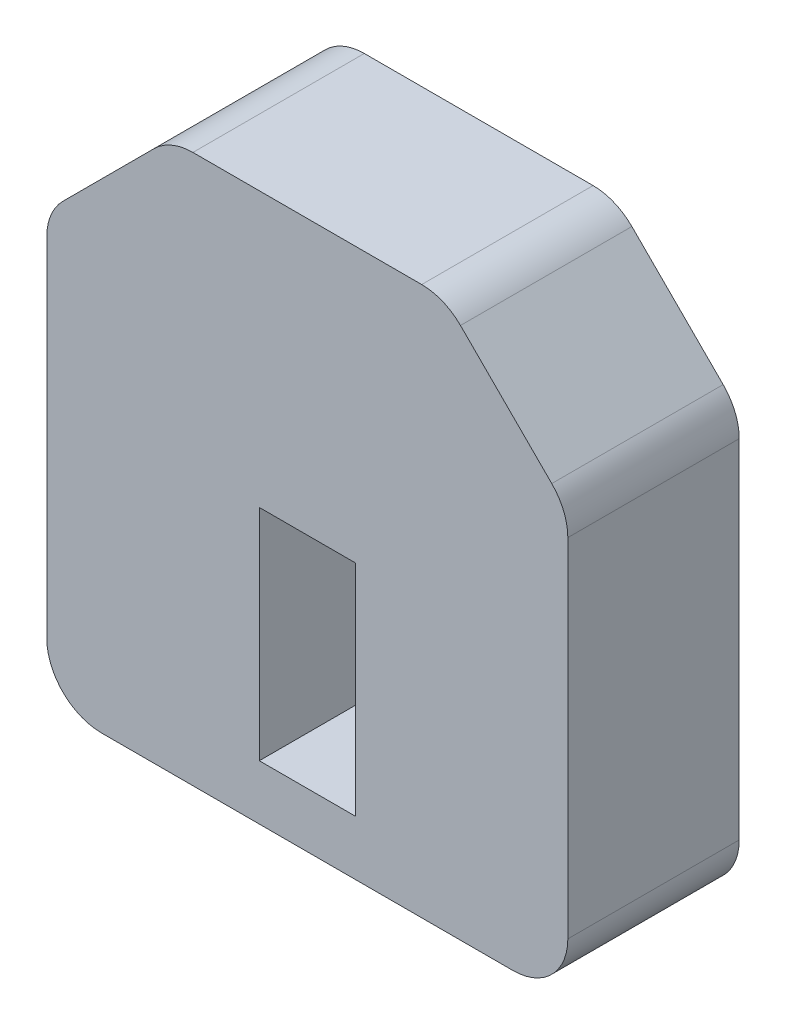
ISO-10303-21;
HEADER;
FILE_DESCRIPTION(('STEP AP214'),'2;1');
FILE_NAME('part.step','',(''),(''),'','','');
FILE_SCHEMA(('AUTOMOTIVE_DESIGN { 1 0 10303 214 1 1 1 1 }'));
ENDSEC;
DATA;
#1=APPLICATION_CONTEXT('core data for automotive mechanical design processes');
#2=APPLICATION_PROTOCOL_DEFINITION('international standard','automotive_design',2000,#1);
#3=PRODUCT_CONTEXT('',#1,'mechanical');
#4=PRODUCT('Part','Part','',(#3));
#5=PRODUCT_RELATED_PRODUCT_CATEGORY('part','',(#4));
#6=PRODUCT_DEFINITION_FORMATION('','',#4);
#7=PRODUCT_DEFINITION_CONTEXT('part definition',#1,'design');
#8=PRODUCT_DEFINITION('design','',#6,#7);
#9=PRODUCT_DEFINITION_SHAPE('','',#8);
#10=(LENGTH_UNIT() NAMED_UNIT(*) SI_UNIT(.MILLI.,.METRE.));
#11=(NAMED_UNIT(*) PLANE_ANGLE_UNIT() SI_UNIT($,.RADIAN.));
#12=(NAMED_UNIT(*) SI_UNIT($,.STERADIAN.) SOLID_ANGLE_UNIT());
#13=UNCERTAINTY_MEASURE_WITH_UNIT(LENGTH_MEASURE(1.E-05),#10,'distance_accuracy_value','');
#14=(GEOMETRIC_REPRESENTATION_CONTEXT(3) GLOBAL_UNCERTAINTY_ASSIGNED_CONTEXT((#13)) GLOBAL_UNIT_ASSIGNED_CONTEXT((#10,
#11,#12)) REPRESENTATION_CONTEXT('',''));
#15=CARTESIAN_POINT('',(0.,0.,0.));
#16=DIRECTION('',(0.,0.,1.));
#17=DIRECTION('',(1.,0.,0.));
#18=AXIS2_PLACEMENT_3D('',#15,#16,#17);
#19=CARTESIAN_POINT('',(0.,0.,12.5));
#20=DIRECTION('',(0.,0.,1.));
#21=DIRECTION('',(1.,0.,0.));
#22=AXIS2_PLACEMENT_3D('',#19,#20,#21);
#23=PLANE('',#22);
#24=DIRECTION('',(0.,-1.,0.));
#25=VECTOR('',#24,1.);
#26=CARTESIAN_POINT('',(-19.,-20.,12.5));
#27=LINE('',#26,#25);
#28=CARTESIAN_POINT('',(-19.,9.3431457505076,12.5));
#29=VERTEX_POINT('',#28);
#30=CARTESIAN_POINT('',(-19.,-16.,12.5));
#31=VERTEX_POINT('',#30);
#32=EDGE_CURVE('E188',#29,#31,#27,.T.);
#33=ORIENTED_EDGE('',*,*,#32,.T.);
#34=CARTESIAN_POINT('',(-15.,-16.,12.5));
#35=DIRECTION('',(0.,0.,1.));
#36=DIRECTION('',(1.,0.,0.));
#37=AXIS2_PLACEMENT_3D('',#34,#35,#36);
#38=CIRCLE('',#37,4.);
#39=CARTESIAN_POINT('',(-15.,-20.,12.5));
#40=VERTEX_POINT('',#39);
#41=EDGE_CURVE('E252',#31,#40,#38,.T.);
#42=ORIENTED_EDGE('',*,*,#41,.T.);
#43=DIRECTION('',(1.,0.,0.));
#44=VECTOR('',#43,1.);
#45=CARTESIAN_POINT('',(19.,-20.,12.5));
#46=LINE('',#45,#44);
#47=CARTESIAN_POINT('',(15.,-20.,12.5));
#48=VERTEX_POINT('',#47);
#49=EDGE_CURVE('E191',#40,#48,#46,.T.);
#50=ORIENTED_EDGE('',*,*,#49,.T.);
#51=CARTESIAN_POINT('',(15.,-16.,12.5));
#52=DIRECTION('',(0.,0.,1.));
#53=DIRECTION('',(1.,0.,0.));
#54=AXIS2_PLACEMENT_3D('',#51,#52,#53);
#55=CIRCLE('',#54,4.);
#56=CARTESIAN_POINT('',(19.,-16.,12.5));
#57=VERTEX_POINT('',#56);
#58=EDGE_CURVE('E250',#48,#57,#55,.T.);
#59=ORIENTED_EDGE('',*,*,#58,.T.);
#60=DIRECTION('',(0.,1.,0.));
#61=VECTOR('',#60,1.);
#62=CARTESIAN_POINT('',(19.,-20.,12.5));
#63=LINE('',#62,#61);
#64=CARTESIAN_POINT('',(19.,9.34314575050759,12.5));
#65=VERTEX_POINT('',#64);
#66=EDGE_CURVE('E195',#57,#65,#63,.T.);
#67=ORIENTED_EDGE('',*,*,#66,.T.);
#68=CARTESIAN_POINT('',(15.,9.34314575050759,12.5));
#69=DIRECTION('',(0.,0.,1.));
#70=DIRECTION('',(1.,0.,0.));
#71=AXIS2_PLACEMENT_3D('',#68,#69,#70);
#72=CIRCLE('',#71,4.);
#73=CARTESIAN_POINT('',(17.8284271247462,12.1715728752538,12.5));
#74=VERTEX_POINT('',#73);
#75=EDGE_CURVE('E248',#65,#74,#72,.T.);
#76=ORIENTED_EDGE('',*,*,#75,.T.);
#77=DIRECTION('',(0.707106781186546,-0.707106781186549,0.));
#78=VECTOR('',#77,1.);
#79=CARTESIAN_POINT('',(15.,15.,12.5));
#80=LINE('',#79,#78);
#81=CARTESIAN_POINT('',(11.1715728752538,18.8284271247462,12.5));
#82=VERTEX_POINT('',#81);
#83=EDGE_CURVE('E218',#74,#82,#80,.F.);
#84=ORIENTED_EDGE('',*,*,#83,.T.);
#85=CARTESIAN_POINT('',(8.34314575050762,16.,12.5));
#86=DIRECTION('',(0.,0.,1.));
#87=DIRECTION('',(1.,0.,0.));
#88=AXIS2_PLACEMENT_3D('',#85,#86,#87);
#89=CIRCLE('',#88,4.);
#90=CARTESIAN_POINT('',(8.34314575050762,20.,12.5));
#91=VERTEX_POINT('',#90);
#92=EDGE_CURVE('E246',#82,#91,#89,.T.);
#93=ORIENTED_EDGE('',*,*,#92,.T.);
#94=DIRECTION('',(-1.,0.,0.));
#95=VECTOR('',#94,1.);
#96=CARTESIAN_POINT('',(19.,20.,12.5));
#97=LINE('',#96,#95);
#98=CARTESIAN_POINT('',(-8.34314575050759,20.,12.5));
#99=VERTEX_POINT('',#98);
#100=EDGE_CURVE('E198',#91,#99,#97,.T.);
#101=ORIENTED_EDGE('',*,*,#100,.T.);
#102=CARTESIAN_POINT('',(-8.34314575050759,16.,12.5));
#103=DIRECTION('',(0.,0.,1.));
#104=DIRECTION('',(1.,0.,0.));
#105=AXIS2_PLACEMENT_3D('',#102,#103,#104);
#106=CIRCLE('',#105,4.);
#107=CARTESIAN_POINT('',(-11.1715728752538,18.8284271247462,12.5));
#108=VERTEX_POINT('',#107);
#109=EDGE_CURVE('E54',#99,#108,#106,.T.);
#110=ORIENTED_EDGE('',*,*,#109,.T.);
#111=DIRECTION('',(0.707106781186549,0.707106781186546,0.));
#112=VECTOR('',#111,1.);
#113=CARTESIAN_POINT('',(-15.,15.,12.5));
#114=LINE('',#113,#112);
#115=CARTESIAN_POINT('',(-17.8284271247462,12.1715728752538,12.5));
#116=VERTEX_POINT('',#115);
#117=EDGE_CURVE('E216',#108,#116,#114,.F.);
#118=ORIENTED_EDGE('',*,*,#117,.T.);
#119=CARTESIAN_POINT('',(-15.,9.3431457505076,12.5));
#120=DIRECTION('',(0.,0.,1.));
#121=DIRECTION('',(1.,0.,0.));
#122=AXIS2_PLACEMENT_3D('',#119,#120,#121);
#123=CIRCLE('',#122,4.);
#124=EDGE_CURVE('E243',#116,#29,#123,.T.);
#125=ORIENTED_EDGE('',*,*,#124,.T.);
#126=EDGE_LOOP('',(#33,#42,#50,#59,#67,#76,#84,#93,#101,#110,#118,#125));
#127=FACE_BOUND('',#126,.T.);
#128=DIRECTION('',(0.,-1.,0.));
#129=VECTOR('',#128,1.);
#130=CARTESIAN_POINT('',(3.5,0.,12.5));
#131=LINE('',#130,#129);
#132=CARTESIAN_POINT('',(3.5,0.,12.5));
#133=VERTEX_POINT('',#132);
#134=CARTESIAN_POINT('',(3.5,-16.,12.5));
#135=VERTEX_POINT('',#134);
#136=EDGE_CURVE('E178',#133,#135,#131,.T.);
#137=ORIENTED_EDGE('',*,*,#136,.T.);
#138=DIRECTION('',(-1.,0.,0.));
#139=VECTOR('',#138,1.);
#140=CARTESIAN_POINT('',(0.,-16.,12.5));
#141=LINE('',#140,#139);
#142=CARTESIAN_POINT('',(-3.5,-16.,12.5));
#143=VERTEX_POINT('',#142);
#144=EDGE_CURVE('E163',#135,#143,#141,.T.);
#145=ORIENTED_EDGE('',*,*,#144,.T.);
#146=DIRECTION('',(0.,-1.,0.));
#147=VECTOR('',#146,1.);
#148=CARTESIAN_POINT('',(-3.5,0.,12.5));
#149=LINE('',#148,#147);
#150=CARTESIAN_POINT('',(-3.5,0.,12.5));
#151=VERTEX_POINT('',#150);
#152=EDGE_CURVE('E169',#151,#143,#149,.T.);
#153=ORIENTED_EDGE('',*,*,#152,.F.);
#154=DIRECTION('',(-1.,0.,0.));
#155=VECTOR('',#154,1.);
#156=CARTESIAN_POINT('',(0.,0.,12.5));
#157=LINE('',#156,#155);
#158=EDGE_CURVE('E172',#133,#151,#157,.T.);
#159=ORIENTED_EDGE('',*,*,#158,.F.);
#160=EDGE_LOOP('',(#137,#145,#153,#159));
#161=FACE_BOUND('',#160,.T.);
#162=ADVANCED_FACE('F33',(#127,#161),#23,.T.);
#163=CARTESIAN_POINT('',(-19.,-20.,12.5));
#164=DIRECTION('',(1.,0.,0.));
#165=DIRECTION('',(0.,0.,-1.));
#166=AXIS2_PLACEMENT_3D('',#163,#164,#165);
#167=PLANE('',#166);
#168=DIRECTION('',(0.,-1.,0.));
#169=VECTOR('',#168,1.);
#170=CARTESIAN_POINT('',(-19.,-20.,0.));
#171=LINE('',#170,#169);
#172=CARTESIAN_POINT('',(-19.,9.3431457505076,0.));
#173=VERTEX_POINT('',#172);
#174=CARTESIAN_POINT('',(-19.,-16.,0.));
#175=VERTEX_POINT('',#174);
#176=EDGE_CURVE('E184',#173,#175,#171,.T.);
#177=ORIENTED_EDGE('',*,*,#176,.T.);
#178=DIRECTION('',(0.,0.,-1.));
#179=VECTOR('',#178,1.);
#180=CARTESIAN_POINT('',(-19.,-16.,12.5));
#181=LINE('',#180,#179);
#182=EDGE_CURVE('E241',#175,#31,#181,.F.);
#183=ORIENTED_EDGE('',*,*,#182,.T.);
#184=ORIENTED_EDGE('',*,*,#32,.F.);
#185=DIRECTION('',(0.,0.,1.));
#186=VECTOR('',#185,1.);
#187=CARTESIAN_POINT('',(-19.,9.3431457505076,0.));
#188=LINE('',#187,#186);
#189=EDGE_CURVE('E238',#29,#173,#188,.F.);
#190=ORIENTED_EDGE('',*,*,#189,.T.);
#191=EDGE_LOOP('',(#177,#183,#184,#190));
#192=FACE_BOUND('',#191,.T.);
#193=ADVANCED_FACE('F315',(#192),#167,.F.);
#194=CARTESIAN_POINT('',(19.,-20.,12.5));
#195=DIRECTION('',(0.,1.,0.));
#196=DIRECTION('',(-1.,0.,0.));
#197=AXIS2_PLACEMENT_3D('',#194,#195,#196);
#198=PLANE('',#197);
#199=ORIENTED_EDGE('',*,*,#49,.F.);
#200=DIRECTION('',(0.,0.,-1.));
#201=VECTOR('',#200,1.);
#202=CARTESIAN_POINT('',(-15.,-20.,12.5));
#203=LINE('',#202,#201);
#204=CARTESIAN_POINT('',(-15.,-20.,0.));
#205=VERTEX_POINT('',#204);
#206=EDGE_CURVE('E223',#40,#205,#203,.T.);
#207=ORIENTED_EDGE('',*,*,#206,.T.);
#208=DIRECTION('',(1.,0.,0.));
#209=VECTOR('',#208,1.);
#210=CARTESIAN_POINT('',(19.,-20.,0.));
#211=LINE('',#210,#209);
#212=CARTESIAN_POINT('',(15.,-20.,0.));
#213=VERTEX_POINT('',#212);
#214=EDGE_CURVE('E203',#205,#213,#211,.T.);
#215=ORIENTED_EDGE('',*,*,#214,.T.);
#216=DIRECTION('',(0.,0.,-1.));
#217=VECTOR('',#216,1.);
#218=CARTESIAN_POINT('',(15.,-20.,12.5));
#219=LINE('',#218,#217);
#220=EDGE_CURVE('E221',#213,#48,#219,.F.);
#221=ORIENTED_EDGE('',*,*,#220,.T.);
#222=EDGE_LOOP('',(#199,#207,#215,#221));
#223=FACE_BOUND('',#222,.T.);
#224=ADVANCED_FACE('F307',(#223),#198,.F.);
#225=CARTESIAN_POINT('',(19.,-20.,12.5));
#226=DIRECTION('',(-1.,0.,0.));
#227=DIRECTION('',(0.,0.,1.));
#228=AXIS2_PLACEMENT_3D('',#225,#226,#227);
#229=PLANE('',#228);
#230=ORIENTED_EDGE('',*,*,#66,.F.);
#231=DIRECTION('',(0.,0.,-1.));
#232=VECTOR('',#231,1.);
#233=CARTESIAN_POINT('',(19.,-16.,12.5));
#234=LINE('',#233,#232);
#235=CARTESIAN_POINT('',(19.,-16.,0.));
#236=VERTEX_POINT('',#235);
#237=EDGE_CURVE('E257',#57,#236,#234,.T.);
#238=ORIENTED_EDGE('',*,*,#237,.T.);
#239=DIRECTION('',(0.,1.,0.));
#240=VECTOR('',#239,1.);
#241=CARTESIAN_POINT('',(19.,-20.,0.));
#242=LINE('',#241,#240);
#243=CARTESIAN_POINT('',(19.,9.34314575050759,0.));
#244=VERTEX_POINT('',#243);
#245=EDGE_CURVE('E206',#236,#244,#242,.T.);
#246=ORIENTED_EDGE('',*,*,#245,.T.);
#247=DIRECTION('',(0.,0.,-1.));
#248=VECTOR('',#247,1.);
#249=CARTESIAN_POINT('',(19.,9.34314575050759,12.5));
#250=LINE('',#249,#248);
#251=EDGE_CURVE('E254',#244,#65,#250,.F.);
#252=ORIENTED_EDGE('',*,*,#251,.T.);
#253=EDGE_LOOP('',(#230,#238,#246,#252));
#254=FACE_BOUND('',#253,.T.);
#255=ADVANCED_FACE('F299',(#254),#229,.F.);
#256=CARTESIAN_POINT('',(19.,20.,12.5));
#257=DIRECTION('',(0.,-1.,0.));
#258=DIRECTION('',(1.,0.,0.));
#259=AXIS2_PLACEMENT_3D('',#256,#257,#258);
#260=PLANE('',#259);
#261=ORIENTED_EDGE('',*,*,#100,.F.);
#262=DIRECTION('',(0.,0.,1.));
#263=VECTOR('',#262,1.);
#264=CARTESIAN_POINT('',(8.34314575050762,20.,0.));
#265=LINE('',#264,#263);
#266=CARTESIAN_POINT('',(8.34314575050762,20.,0.));
#267=VERTEX_POINT('',#266);
#268=EDGE_CURVE('E267',#91,#267,#265,.F.);
#269=ORIENTED_EDGE('',*,*,#268,.T.);
#270=DIRECTION('',(-1.,0.,0.));
#271=VECTOR('',#270,1.);
#272=CARTESIAN_POINT('',(19.,20.,0.));
#273=LINE('',#272,#271);
#274=CARTESIAN_POINT('',(-8.34314575050759,20.,0.));
#275=VERTEX_POINT('',#274);
#276=EDGE_CURVE('E192',#267,#275,#273,.T.);
#277=ORIENTED_EDGE('',*,*,#276,.T.);
#278=DIRECTION('',(0.,0.,-1.));
#279=VECTOR('',#278,1.);
#280=CARTESIAN_POINT('',(-8.34314575050759,20.,12.5));
#281=LINE('',#280,#279);
#282=EDGE_CURVE('E264',#275,#99,#281,.F.);
#283=ORIENTED_EDGE('',*,*,#282,.T.);
#284=EDGE_LOOP('',(#261,#269,#277,#283));
#285=FACE_BOUND('',#284,.T.);
#286=ADVANCED_FACE('F273',(#285),#260,.F.);
#287=CARTESIAN_POINT('',(0.,0.,0.));
#288=DIRECTION('',(0.,0.,1.));
#289=DIRECTION('',(1.,0.,0.));
#290=AXIS2_PLACEMENT_3D('',#287,#288,#289);
#291=PLANE('',#290);
#292=ORIENTED_EDGE('',*,*,#214,.F.);
#293=CARTESIAN_POINT('',(-15.,-16.,0.));
#294=DIRECTION('',(0.,0.,1.));
#295=DIRECTION('',(1.,0.,0.));
#296=AXIS2_PLACEMENT_3D('',#293,#294,#295);
#297=CIRCLE('',#296,4.);
#298=EDGE_CURVE('E236',#205,#175,#297,.F.);
#299=ORIENTED_EDGE('',*,*,#298,.T.);
#300=ORIENTED_EDGE('',*,*,#176,.F.);
#301=CARTESIAN_POINT('',(-15.,9.3431457505076,0.));
#302=DIRECTION('',(0.,0.,1.));
#303=DIRECTION('',(1.,0.,0.));
#304=AXIS2_PLACEMENT_3D('',#301,#302,#303);
#305=CIRCLE('',#304,4.);
#306=CARTESIAN_POINT('',(-17.8284271247462,12.1715728752538,0.));
#307=VERTEX_POINT('',#306);
#308=EDGE_CURVE('E226',#173,#307,#305,.F.);
#309=ORIENTED_EDGE('',*,*,#308,.T.);
#310=DIRECTION('',(-0.707106781186549,-0.707106781186546,0.));
#311=VECTOR('',#310,1.);
#312=CARTESIAN_POINT('',(-19.,11.,0.));
#313=LINE('',#312,#311);
#314=CARTESIAN_POINT('',(-11.1715728752538,18.8284271247462,0.));
#315=VERTEX_POINT('',#314);
#316=EDGE_CURVE('E200',#307,#315,#313,.F.);
#317=ORIENTED_EDGE('',*,*,#316,.T.);
#318=CARTESIAN_POINT('',(-8.34314575050759,16.,0.));
#319=DIRECTION('',(0.,0.,1.));
#320=DIRECTION('',(1.,0.,0.));
#321=AXIS2_PLACEMENT_3D('',#318,#319,#320);
#322=CIRCLE('',#321,4.);
#323=EDGE_CURVE('E228',#315,#275,#322,.F.);
#324=ORIENTED_EDGE('',*,*,#323,.T.);
#325=ORIENTED_EDGE('',*,*,#276,.F.);
#326=CARTESIAN_POINT('',(8.34314575050762,16.,0.));
#327=DIRECTION('',(0.,0.,1.));
#328=DIRECTION('',(1.,0.,0.));
#329=AXIS2_PLACEMENT_3D('',#326,#327,#328);
#330=CIRCLE('',#329,4.);
#331=CARTESIAN_POINT('',(11.1715728752538,18.8284271247462,0.));
#332=VERTEX_POINT('',#331);
#333=EDGE_CURVE('E230',#267,#332,#330,.F.);
#334=ORIENTED_EDGE('',*,*,#333,.T.);
#335=DIRECTION('',(-0.707106781186546,0.707106781186549,0.));
#336=VECTOR('',#335,1.);
#337=CARTESIAN_POINT('',(10.,20.,0.));
#338=LINE('',#337,#336);
#339=CARTESIAN_POINT('',(17.8284271247462,12.1715728752538,0.));
#340=VERTEX_POINT('',#339);
#341=EDGE_CURVE('E213',#332,#340,#338,.F.);
#342=ORIENTED_EDGE('',*,*,#341,.T.);
#343=CARTESIAN_POINT('',(15.,9.34314575050759,0.));
#344=DIRECTION('',(0.,0.,1.));
#345=DIRECTION('',(1.,0.,0.));
#346=AXIS2_PLACEMENT_3D('',#343,#344,#345);
#347=CIRCLE('',#346,4.);
#348=EDGE_CURVE('E232',#340,#244,#347,.F.);
#349=ORIENTED_EDGE('',*,*,#348,.T.);
#350=ORIENTED_EDGE('',*,*,#245,.F.);
#351=CARTESIAN_POINT('',(15.,-16.,0.));
#352=DIRECTION('',(0.,0.,1.));
#353=DIRECTION('',(1.,0.,0.));
#354=AXIS2_PLACEMENT_3D('',#351,#352,#353);
#355=CIRCLE('',#354,4.);
#356=EDGE_CURVE('E234',#236,#213,#355,.F.);
#357=ORIENTED_EDGE('',*,*,#356,.T.);
#358=EDGE_LOOP('',(#292,#299,#300,#309,#317,#324,#325,#334,#342,#349,#350,#357));
#359=FACE_BOUND('',#358,.T.);
#360=ADVANCED_FACE('F279',(#359),#291,.F.);
#361=CARTESIAN_POINT('',(0.,-16.,0.5));
#362=DIRECTION('',(0.,1.,0.));
#363=DIRECTION('',(0.,0.,1.));
#364=AXIS2_PLACEMENT_3D('',#361,#362,#363);
#365=PLANE('',#364);
#366=ORIENTED_EDGE('',*,*,#144,.F.);
#367=DIRECTION('',(0.,0.,1.));
#368=VECTOR('',#367,1.);
#369=CARTESIAN_POINT('',(3.5,-16.,0.5));
#370=LINE('',#369,#368);
#371=CARTESIAN_POINT('',(3.5,-16.,0.5));
#372=VERTEX_POINT('',#371);
#373=EDGE_CURVE('E149',#372,#135,#370,.T.);
#374=ORIENTED_EDGE('',*,*,#373,.F.);
#375=DIRECTION('',(-1.,0.,0.));
#376=VECTOR('',#375,1.);
#377=CARTESIAN_POINT('',(0.,-16.,0.5));
#378=LINE('',#377,#376);
#379=CARTESIAN_POINT('',(-3.5,-16.,0.5));
#380=VERTEX_POINT('',#379);
#381=EDGE_CURVE('E157',#372,#380,#378,.T.);
#382=ORIENTED_EDGE('',*,*,#381,.T.);
#383=DIRECTION('',(0.,0.,1.));
#384=VECTOR('',#383,1.);
#385=CARTESIAN_POINT('',(-3.5,-16.,0.5));
#386=LINE('',#385,#384);
#387=EDGE_CURVE('E182',#380,#143,#386,.T.);
#388=ORIENTED_EDGE('',*,*,#387,.T.);
#389=EDGE_LOOP('',(#366,#374,#382,#388));
#390=FACE_BOUND('',#389,.T.);
#391=ADVANCED_FACE('F160',(#390),#365,.T.);
#392=CARTESIAN_POINT('',(-3.5,0.,0.5));
#393=DIRECTION('',(-1.,0.,0.));
#394=DIRECTION('',(0.,-1.,0.));
#395=AXIS2_PLACEMENT_3D('',#392,#393,#394);
#396=PLANE('',#395);
#397=ORIENTED_EDGE('',*,*,#152,.T.);
#398=ORIENTED_EDGE('',*,*,#387,.F.);
#399=DIRECTION('',(0.,-1.,0.));
#400=VECTOR('',#399,1.);
#401=CARTESIAN_POINT('',(-3.5,0.,0.5));
#402=LINE('',#401,#400);
#403=CARTESIAN_POINT('',(-3.5,0.,0.5));
#404=VERTEX_POINT('',#403);
#405=EDGE_CURVE('E164',#404,#380,#402,.T.);
#406=ORIENTED_EDGE('',*,*,#405,.F.);
#407=DIRECTION('',(0.,0.,1.));
#408=VECTOR('',#407,1.);
#409=CARTESIAN_POINT('',(-3.5,0.,0.5));
#410=LINE('',#409,#408);
#411=EDGE_CURVE('E185',#404,#151,#410,.T.);
#412=ORIENTED_EDGE('',*,*,#411,.T.);
#413=EDGE_LOOP('',(#397,#398,#406,#412));
#414=FACE_BOUND('',#413,.T.);
#415=ADVANCED_FACE('F368',(#414),#396,.F.);
#416=CARTESIAN_POINT('',(0.,0.,0.5));
#417=DIRECTION('',(0.,1.,0.));
#418=DIRECTION('',(0.,0.,1.));
#419=AXIS2_PLACEMENT_3D('',#416,#417,#418);
#420=PLANE('',#419);
#421=ORIENTED_EDGE('',*,*,#158,.T.);
#422=ORIENTED_EDGE('',*,*,#411,.F.);
#423=DIRECTION('',(-1.,0.,0.));
#424=VECTOR('',#423,1.);
#425=CARTESIAN_POINT('',(0.,0.,0.5));
#426=LINE('',#425,#424);
#427=CARTESIAN_POINT('',(3.5,0.,0.5));
#428=VERTEX_POINT('',#427);
#429=EDGE_CURVE('E156',#428,#404,#426,.T.);
#430=ORIENTED_EDGE('',*,*,#429,.F.);
#431=DIRECTION('',(0.,0.,1.));
#432=VECTOR('',#431,1.);
#433=CARTESIAN_POINT('',(3.5,0.,0.5));
#434=LINE('',#433,#432);
#435=EDGE_CURVE('E151',#428,#133,#434,.T.);
#436=ORIENTED_EDGE('',*,*,#435,.T.);
#437=EDGE_LOOP('',(#421,#422,#430,#436));
#438=FACE_BOUND('',#437,.T.);
#439=ADVANCED_FACE('F374',(#438),#420,.F.);
#440=CARTESIAN_POINT('',(3.5,0.,0.5));
#441=DIRECTION('',(-1.,0.,0.));
#442=DIRECTION('',(0.,-1.,0.));
#443=AXIS2_PLACEMENT_3D('',#440,#441,#442);
#444=PLANE('',#443);
#445=ORIENTED_EDGE('',*,*,#136,.F.);
#446=ORIENTED_EDGE('',*,*,#435,.F.);
#447=DIRECTION('',(0.,-1.,0.));
#448=VECTOR('',#447,1.);
#449=CARTESIAN_POINT('',(3.5,0.,0.5));
#450=LINE('',#449,#448);
#451=EDGE_CURVE('E145',#428,#372,#450,.T.);
#452=ORIENTED_EDGE('',*,*,#451,.T.);
#453=ORIENTED_EDGE('',*,*,#373,.T.);
#454=EDGE_LOOP('',(#445,#446,#452,#453));
#455=FACE_BOUND('',#454,.T.);
#456=ADVANCED_FACE('F148',(#455),#444,.T.);
#457=CARTESIAN_POINT('',(0.,0.,0.5));
#458=DIRECTION('',(0.,0.,1.));
#459=DIRECTION('',(1.,0.,0.));
#460=AXIS2_PLACEMENT_3D('',#457,#458,#459);
#461=PLANE('',#460);
#462=ORIENTED_EDGE('',*,*,#381,.F.);
#463=ORIENTED_EDGE('',*,*,#451,.F.);
#464=ORIENTED_EDGE('',*,*,#429,.T.);
#465=ORIENTED_EDGE('',*,*,#405,.T.);
#466=EDGE_LOOP('',(#462,#463,#464,#465));
#467=FACE_BOUND('',#466,.T.);
#468=ADVANCED_FACE('F167',(#467),#461,.T.);
#469=CARTESIAN_POINT('',(10.,20.,12.5));
#470=DIRECTION('',(-0.707106781186549,-0.707106781186546,0.));
#471=DIRECTION('',(0.,0.,-1.));
#472=AXIS2_PLACEMENT_3D('',#469,#470,#471);
#473=PLANE('',#472);
#474=ORIENTED_EDGE('',*,*,#83,.F.);
#475=DIRECTION('',(0.,0.,1.));
#476=VECTOR('',#475,1.);
#477=CARTESIAN_POINT('',(17.8284271247462,12.1715728752538,0.));
#478=LINE('',#477,#476);
#479=EDGE_CURVE('E262',#74,#340,#478,.F.);
#480=ORIENTED_EDGE('',*,*,#479,.T.);
#481=ORIENTED_EDGE('',*,*,#341,.F.);
#482=DIRECTION('',(0.,0.,-1.));
#483=VECTOR('',#482,1.);
#484=CARTESIAN_POINT('',(11.1715728752538,18.8284271247462,12.5));
#485=LINE('',#484,#483);
#486=EDGE_CURVE('E260',#332,#82,#485,.F.);
#487=ORIENTED_EDGE('',*,*,#486,.T.);
#488=EDGE_LOOP('',(#474,#480,#481,#487));
#489=FACE_BOUND('',#488,.T.);
#490=ADVANCED_FACE('F290',(#489),#473,.F.);
#491=CARTESIAN_POINT('',(-19.,11.,12.5));
#492=DIRECTION('',(0.707106781186546,-0.707106781186549,0.));
#493=DIRECTION('',(0.,0.,-1.));
#494=AXIS2_PLACEMENT_3D('',#491,#492,#493);
#495=PLANE('',#494);
#496=ORIENTED_EDGE('',*,*,#117,.F.);
#497=DIRECTION('',(0.,0.,1.));
#498=VECTOR('',#497,1.);
#499=CARTESIAN_POINT('',(-11.1715728752538,18.8284271247462,0.));
#500=LINE('',#499,#498);
#501=EDGE_CURVE('E11',#108,#315,#500,.F.);
#502=ORIENTED_EDGE('',*,*,#501,.T.);
#503=ORIENTED_EDGE('',*,*,#316,.F.);
#504=DIRECTION('',(0.,0.,-1.));
#505=VECTOR('',#504,1.);
#506=CARTESIAN_POINT('',(-17.8284271247462,12.1715728752538,12.5));
#507=LINE('',#506,#505);
#508=EDGE_CURVE('E41',#307,#116,#507,.F.);
#509=ORIENTED_EDGE('',*,*,#508,.T.);
#510=EDGE_LOOP('',(#496,#502,#503,#509));
#511=FACE_BOUND('',#510,.T.);
#512=ADVANCED_FACE('F320',(#511),#495,.F.);
#513=CARTESIAN_POINT('',(-15.,-16.,12.5));
#514=DIRECTION('',(0.,0.,-1.));
#515=DIRECTION('',(-1.,0.,0.));
#516=AXIS2_PLACEMENT_3D('',#513,#514,#515);
#517=CYLINDRICAL_SURFACE('',#516,4.);
#518=ORIENTED_EDGE('',*,*,#41,.F.);
#519=ORIENTED_EDGE('',*,*,#182,.F.);
#520=ORIENTED_EDGE('',*,*,#298,.F.);
#521=ORIENTED_EDGE('',*,*,#206,.F.);
#522=EDGE_LOOP('',(#518,#519,#520,#521));
#523=FACE_BOUND('',#522,.T.);
#524=ADVANCED_FACE('F311',(#523),#517,.T.);
#525=CARTESIAN_POINT('',(15.,-16.,12.5));
#526=DIRECTION('',(0.,0.,-1.));
#527=DIRECTION('',(-1.,0.,0.));
#528=AXIS2_PLACEMENT_3D('',#525,#526,#527);
#529=CYLINDRICAL_SURFACE('',#528,4.);
#530=ORIENTED_EDGE('',*,*,#58,.F.);
#531=ORIENTED_EDGE('',*,*,#220,.F.);
#532=ORIENTED_EDGE('',*,*,#356,.F.);
#533=ORIENTED_EDGE('',*,*,#237,.F.);
#534=EDGE_LOOP('',(#530,#531,#532,#533));
#535=FACE_BOUND('',#534,.T.);
#536=ADVANCED_FACE('F305',(#535),#529,.T.);
#537=CARTESIAN_POINT('',(15.,9.34314575050759,12.5));
#538=DIRECTION('',(0.,0.,1.));
#539=DIRECTION('',(1.,0.,0.));
#540=AXIS2_PLACEMENT_3D('',#537,#538,#539);
#541=CYLINDRICAL_SURFACE('',#540,4.);
#542=ORIENTED_EDGE('',*,*,#348,.F.);
#543=ORIENTED_EDGE('',*,*,#479,.F.);
#544=ORIENTED_EDGE('',*,*,#75,.F.);
#545=ORIENTED_EDGE('',*,*,#251,.F.);
#546=EDGE_LOOP('',(#542,#543,#544,#545));
#547=FACE_BOUND('',#546,.T.);
#548=ADVANCED_FACE('F296',(#547),#541,.T.);
#549=CARTESIAN_POINT('',(8.34314575050762,16.,12.5));
#550=DIRECTION('',(0.,0.,-1.));
#551=DIRECTION('',(-1.,0.,0.));
#552=AXIS2_PLACEMENT_3D('',#549,#550,#551);
#553=CYLINDRICAL_SURFACE('',#552,4.);
#554=ORIENTED_EDGE('',*,*,#92,.F.);
#555=ORIENTED_EDGE('',*,*,#486,.F.);
#556=ORIENTED_EDGE('',*,*,#333,.F.);
#557=ORIENTED_EDGE('',*,*,#268,.F.);
#558=EDGE_LOOP('',(#554,#555,#556,#557));
#559=FACE_BOUND('',#558,.T.);
#560=ADVANCED_FACE('F288',(#559),#553,.T.);
#561=CARTESIAN_POINT('',(-8.34314575050759,16.,12.5));
#562=DIRECTION('',(0.,0.,1.));
#563=DIRECTION('',(1.,0.,0.));
#564=AXIS2_PLACEMENT_3D('',#561,#562,#563);
#565=CYLINDRICAL_SURFACE('',#564,4.);
#566=ORIENTED_EDGE('',*,*,#323,.F.);
#567=ORIENTED_EDGE('',*,*,#501,.F.);
#568=ORIENTED_EDGE('',*,*,#109,.F.);
#569=ORIENTED_EDGE('',*,*,#282,.F.);
#570=EDGE_LOOP('',(#566,#567,#568,#569));
#571=FACE_BOUND('',#570,.T.);
#572=ADVANCED_FACE('F284',(#571),#565,.T.);
#573=CARTESIAN_POINT('',(-15.,9.3431457505076,12.5));
#574=DIRECTION('',(0.,0.,-1.));
#575=DIRECTION('',(-1.,0.,0.));
#576=AXIS2_PLACEMENT_3D('',#573,#574,#575);
#577=CYLINDRICAL_SURFACE('',#576,4.);
#578=ORIENTED_EDGE('',*,*,#124,.F.);
#579=ORIENTED_EDGE('',*,*,#508,.F.);
#580=ORIENTED_EDGE('',*,*,#308,.F.);
#581=ORIENTED_EDGE('',*,*,#189,.F.);
#582=EDGE_LOOP('',(#578,#579,#580,#581));
#583=FACE_BOUND('',#582,.T.);
#584=ADVANCED_FACE('F35',(#583),#577,.T.);
#585=CLOSED_SHELL('',(#162,#193,#224,#255,#286,#360,#391,#415,#439,#456,#468,#490,#512,#524,
#536,#548,#560,#572,#584));
#586=MANIFOLD_SOLID_BREP('B2',#585);
#587=ADVANCED_BREP_SHAPE_REPRESENTATION('',(#18,#586),#14);
#588=SHAPE_DEFINITION_REPRESENTATION(#9,#587);
ENDSEC;
END-ISO-10303-21;
